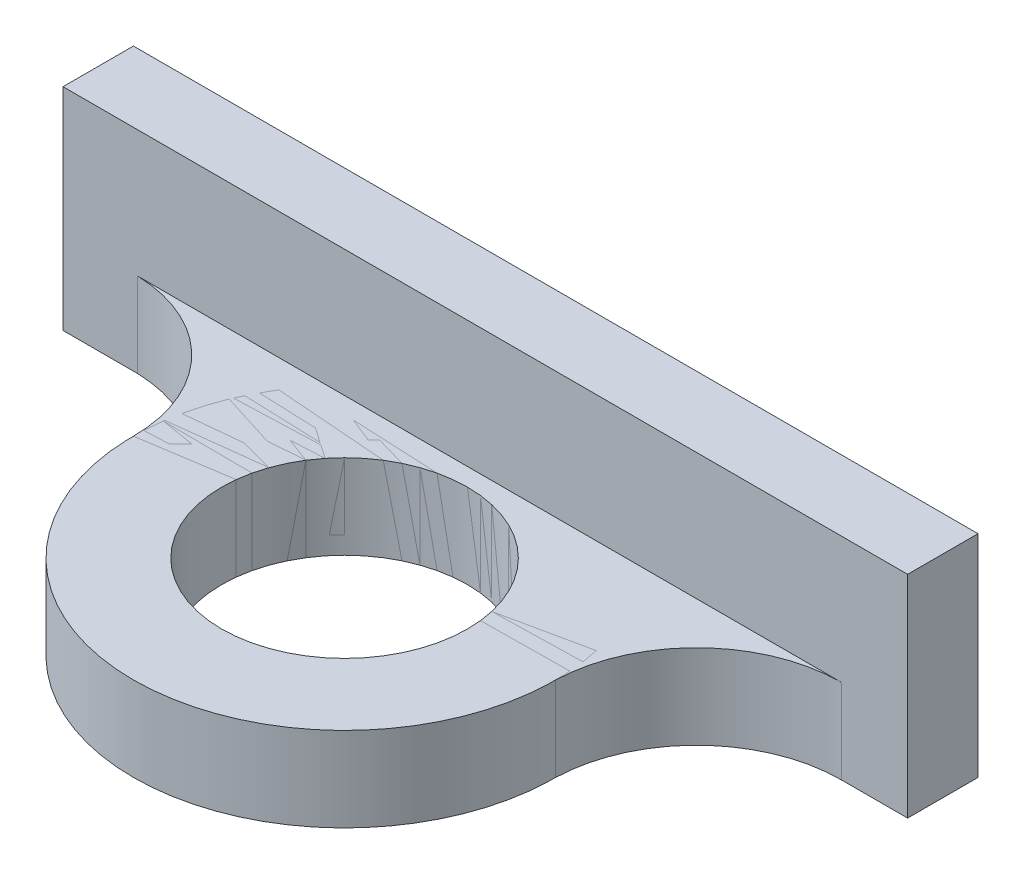
ISO-10303-21;
HEADER;
FILE_DESCRIPTION(('STEP AP214'),'2;1');
FILE_NAME('part.step','',(''),(''),'','','');
FILE_SCHEMA(('AUTOMOTIVE_DESIGN { 1 0 10303 214 1 1 1 1 }'));
ENDSEC;
DATA;
#1=APPLICATION_CONTEXT('core data for automotive mechanical design processes');
#2=APPLICATION_PROTOCOL_DEFINITION('international standard','automotive_design',2000,#1);
#3=PRODUCT_CONTEXT('',#1,'mechanical');
#4=PRODUCT('Part','Part','',(#3));
#5=PRODUCT_RELATED_PRODUCT_CATEGORY('part','',(#4));
#6=PRODUCT_DEFINITION_FORMATION('','',#4);
#7=PRODUCT_DEFINITION_CONTEXT('part definition',#1,'design');
#8=PRODUCT_DEFINITION('design','',#6,#7);
#9=PRODUCT_DEFINITION_SHAPE('','',#8);
#10=(LENGTH_UNIT() NAMED_UNIT(*) SI_UNIT(.MILLI.,.METRE.));
#11=(NAMED_UNIT(*) PLANE_ANGLE_UNIT() SI_UNIT($,.RADIAN.));
#12=(NAMED_UNIT(*) SI_UNIT($,.STERADIAN.) SOLID_ANGLE_UNIT());
#13=UNCERTAINTY_MEASURE_WITH_UNIT(LENGTH_MEASURE(1.E-05),#10,'distance_accuracy_value','');
#14=(GEOMETRIC_REPRESENTATION_CONTEXT(3) GLOBAL_UNCERTAINTY_ASSIGNED_CONTEXT((#13)) GLOBAL_UNIT_ASSIGNED_CONTEXT((#10,
#11,#12)) REPRESENTATION_CONTEXT('',''));
#15=CARTESIAN_POINT('',(0.,0.,0.));
#16=DIRECTION('',(0.,0.,1.));
#17=DIRECTION('',(1.,0.,0.));
#18=AXIS2_PLACEMENT_3D('',#15,#16,#17);
#19=CARTESIAN_POINT('',(0.,12.,-20.));
#20=DIRECTION('',(0.,0.,-1.));
#21=DIRECTION('',(-1.,0.,0.));
#22=AXIS2_PLACEMENT_3D('',#19,#20,#21);
#23=PLANE('',#22);
#24=DIRECTION('',(1.,0.,0.));
#25=VECTOR('',#24,1.);
#26=CARTESIAN_POINT('',(0.,0.,-20.));
#27=LINE('',#26,#25);
#28=CARTESIAN_POINT('',(-49.4267459225817,0.,-20.));
#29=VERTEX_POINT('',#28);
#30=CARTESIAN_POINT('',(50.5901699437495,0.,-20.));
#31=VERTEX_POINT('',#30);
#32=EDGE_CURVE('E131',#29,#31,#27,.T.);
#33=ORIENTED_EDGE('',*,*,#32,.F.);
#34=DIRECTION('',(0.,-1.,0.));
#35=VECTOR('',#34,1.);
#36=CARTESIAN_POINT('',(-49.4267459225817,12.,-20.));
#37=LINE('',#36,#35);
#38=CARTESIAN_POINT('',(-49.4267459225817,12.,-20.));
#39=VERTEX_POINT('',#38);
#40=EDGE_CURVE('E12',#39,#29,#37,.T.);
#41=ORIENTED_EDGE('',*,*,#40,.F.);
#42=DIRECTION('',(1.,0.,0.));
#43=VECTOR('',#42,1.);
#44=CARTESIAN_POINT('',(0.,12.,-20.));
#45=LINE('',#44,#43);
#46=CARTESIAN_POINT('',(50.5901699437495,12.,-20.));
#47=VERTEX_POINT('',#46);
#48=EDGE_CURVE('E145',#39,#47,#45,.T.);
#49=ORIENTED_EDGE('',*,*,#48,.T.);
#50=DIRECTION('',(0.,-1.,0.));
#51=VECTOR('',#50,1.);
#52=CARTESIAN_POINT('',(50.5901699437495,12.,-20.));
#53=LINE('',#52,#51);
#54=EDGE_CURVE('E49',#47,#31,#53,.T.);
#55=ORIENTED_EDGE('',*,*,#54,.T.);
#56=EDGE_LOOP('',(#33,#41,#49,#55));
#57=FACE_BOUND('',#56,.T.);
#58=ADVANCED_FACE('F46',(#57),#23,.T.);
#59=CARTESIAN_POINT('',(-50.0084579331656,12.,0.));
#60=DIRECTION('',(0.,-1.,0.));
#61=DIRECTION('',(0.,0.,-1.));
#62=AXIS2_PLACEMENT_3D('',#59,#60,#61);
#63=CYLINDRICAL_SURFACE('',#62,20.0084579331656);
#64=CARTESIAN_POINT('',(-50.0084579331656,0.,0.));
#65=DIRECTION('',(0.,-1.,0.));
#66=DIRECTION('',(0.,0.,-1.));
#67=AXIS2_PLACEMENT_3D('',#64,#65,#66);
#68=CIRCLE('',#67,20.0084579331656);
#69=CARTESIAN_POINT('',(-30.,0.,0.));
#70=VERTEX_POINT('',#69);
#71=EDGE_CURVE('E143',#70,#29,#68,.F.);
#72=ORIENTED_EDGE('',*,*,#71,.F.);
#73=DIRECTION('',(0.,-1.,0.));
#74=VECTOR('',#73,1.);
#75=CARTESIAN_POINT('',(-30.,12.,0.));
#76=LINE('',#75,#74);
#77=CARTESIAN_POINT('',(-30.,12.,0.));
#78=VERTEX_POINT('',#77);
#79=EDGE_CURVE('E55',#78,#70,#76,.T.);
#80=ORIENTED_EDGE('',*,*,#79,.F.);
#81=CARTESIAN_POINT('',(-50.0084579331656,12.,0.));
#82=DIRECTION('',(0.,-1.,0.));
#83=DIRECTION('',(0.,0.,-1.));
#84=AXIS2_PLACEMENT_3D('',#81,#82,#83);
#85=CIRCLE('',#84,20.0084579331656);
#86=EDGE_CURVE('E113',#78,#39,#85,.F.);
#87=ORIENTED_EDGE('',*,*,#86,.T.);
#88=ORIENTED_EDGE('',*,*,#40,.T.);
#89=EDGE_LOOP('',(#72,#80,#87,#88));
#90=FACE_BOUND('',#89,.T.);
#91=ADVANCED_FACE('F153',(#90),#63,.F.);
#92=CARTESIAN_POINT('',(0.,12.,0.));
#93=DIRECTION('',(0.,0.,-1.));
#94=DIRECTION('',(-1.,0.,0.));
#95=AXIS2_PLACEMENT_3D('',#92,#93,#94);
#96=PLANE('',#95);
#97=DIRECTION('',(1.,0.,0.));
#98=VECTOR('',#97,1.);
#99=CARTESIAN_POINT('',(0.,0.,0.));
#100=LINE('',#99,#98);
#101=CARTESIAN_POINT('',(-17.4625,0.,0.));
#102=VERTEX_POINT('',#101);
#103=EDGE_CURVE('E117',#70,#102,#100,.T.);
#104=ORIENTED_EDGE('',*,*,#103,.T.);
#105=DIRECTION('',(0.,-1.,0.));
#106=VECTOR('',#105,1.);
#107=CARTESIAN_POINT('',(-17.4625,12.,0.));
#108=LINE('',#107,#106);
#109=CARTESIAN_POINT('',(-17.4625,12.,0.));
#110=VERTEX_POINT('',#109);
#111=EDGE_CURVE('E115',#110,#102,#108,.T.);
#112=ORIENTED_EDGE('',*,*,#111,.F.);
#113=DIRECTION('',(1.,0.,0.));
#114=VECTOR('',#113,1.);
#115=CARTESIAN_POINT('',(0.,12.,0.));
#116=LINE('',#115,#114);
#117=EDGE_CURVE('E106',#78,#110,#116,.T.);
#118=ORIENTED_EDGE('',*,*,#117,.F.);
#119=ORIENTED_EDGE('',*,*,#79,.T.);
#120=EDGE_LOOP('',(#104,#112,#118,#119));
#121=FACE_BOUND('',#120,.T.);
#122=ADVANCED_FACE('F116',(#121),#96,.F.);
#123=CARTESIAN_POINT('',(0.,12.,0.));
#124=DIRECTION('',(0.,-1.,0.));
#125=DIRECTION('',(0.,0.,-1.));
#126=AXIS2_PLACEMENT_3D('',#123,#124,#125);
#127=CYLINDRICAL_SURFACE('',#126,17.4625);
#128=CARTESIAN_POINT('',(0.,0.,0.));
#129=DIRECTION('',(0.,-1.,0.));
#130=DIRECTION('',(0.,0.,-1.));
#131=AXIS2_PLACEMENT_3D('',#128,#129,#130);
#132=CIRCLE('',#131,17.4625);
#133=CARTESIAN_POINT('',(17.4625,0.,0.));
#134=VERTEX_POINT('',#133);
#135=EDGE_CURVE('E140',#134,#102,#132,.F.);
#136=ORIENTED_EDGE('',*,*,#135,.F.);
#137=DIRECTION('',(0.,-1.,0.));
#138=VECTOR('',#137,1.);
#139=CARTESIAN_POINT('',(17.4625,12.,0.));
#140=LINE('',#139,#138);
#141=CARTESIAN_POINT('',(17.4625,12.,0.));
#142=VERTEX_POINT('',#141);
#143=EDGE_CURVE('E121',#142,#134,#140,.T.);
#144=ORIENTED_EDGE('',*,*,#143,.F.);
#145=CARTESIAN_POINT('',(0.,12.,0.));
#146=DIRECTION('',(0.,-1.,0.));
#147=DIRECTION('',(0.,0.,-1.));
#148=AXIS2_PLACEMENT_3D('',#145,#146,#147);
#149=CIRCLE('',#148,17.4625);
#150=EDGE_CURVE('E111',#142,#110,#149,.F.);
#151=ORIENTED_EDGE('',*,*,#150,.T.);
#152=ORIENTED_EDGE('',*,*,#111,.T.);
#153=EDGE_LOOP('',(#136,#144,#151,#152));
#154=FACE_BOUND('',#153,.T.);
#155=ADVANCED_FACE('F123',(#154),#127,.F.);
#156=CARTESIAN_POINT('',(0.,12.,0.));
#157=DIRECTION('',(0.,0.,1.));
#158=DIRECTION('',(1.,0.,0.));
#159=AXIS2_PLACEMENT_3D('',#156,#157,#158);
#160=PLANE('',#159);
#161=DIRECTION('',(-1.,0.,0.));
#162=VECTOR('',#161,1.);
#163=CARTESIAN_POINT('',(0.,0.,0.));
#164=LINE('',#163,#162);
#165=CARTESIAN_POINT('',(30.,0.,0.));
#166=VERTEX_POINT('',#165);
#167=EDGE_CURVE('E137',#166,#134,#164,.T.);
#168=ORIENTED_EDGE('',*,*,#167,.F.);
#169=DIRECTION('',(0.,-1.,0.));
#170=VECTOR('',#169,1.);
#171=CARTESIAN_POINT('',(30.,12.,0.));
#172=LINE('',#171,#170);
#173=CARTESIAN_POINT('',(30.,12.,0.));
#174=VERTEX_POINT('',#173);
#175=EDGE_CURVE('E148',#174,#166,#172,.T.);
#176=ORIENTED_EDGE('',*,*,#175,.F.);
#177=DIRECTION('',(-1.,0.,0.));
#178=VECTOR('',#177,1.);
#179=CARTESIAN_POINT('',(0.,12.,0.));
#180=LINE('',#179,#178);
#181=EDGE_CURVE('E124',#174,#142,#180,.T.);
#182=ORIENTED_EDGE('',*,*,#181,.T.);
#183=ORIENTED_EDGE('',*,*,#143,.T.);
#184=EDGE_LOOP('',(#168,#176,#182,#183));
#185=FACE_BOUND('',#184,.T.);
#186=ADVANCED_FACE('F166',(#185),#160,.T.);
#187=CARTESIAN_POINT('',(50.5901699437495,12.,0.598877457812112));
#188=DIRECTION('',(0.,-1.,0.));
#189=DIRECTION('',(0.,0.,-1.));
#190=AXIS2_PLACEMENT_3D('',#187,#188,#189);
#191=CYLINDRICAL_SURFACE('',#190,20.5988774578121);
#192=CARTESIAN_POINT('',(50.5901699437495,0.,0.598877457812112));
#193=DIRECTION('',(0.,-1.,0.));
#194=DIRECTION('',(0.,0.,-1.));
#195=AXIS2_PLACEMENT_3D('',#192,#193,#194);
#196=CIRCLE('',#195,20.5988774578121);
#197=EDGE_CURVE('E134',#31,#166,#196,.F.);
#198=ORIENTED_EDGE('',*,*,#197,.F.);
#199=ORIENTED_EDGE('',*,*,#54,.F.);
#200=CARTESIAN_POINT('',(50.5901699437495,12.,0.598877457812112));
#201=DIRECTION('',(0.,-1.,0.));
#202=DIRECTION('',(0.,0.,-1.));
#203=AXIS2_PLACEMENT_3D('',#200,#201,#202);
#204=CIRCLE('',#203,20.5988774578121);
#205=EDGE_CURVE('E126',#47,#174,#204,.F.);
#206=ORIENTED_EDGE('',*,*,#205,.T.);
#207=ORIENTED_EDGE('',*,*,#175,.T.);
#208=EDGE_LOOP('',(#198,#199,#206,#207));
#209=FACE_BOUND('',#208,.T.);
#210=ADVANCED_FACE('F150',(#209),#191,.F.);
#211=CARTESIAN_POINT('',(0.,12.,0.));
#212=DIRECTION('',(0.,-1.,0.));
#213=DIRECTION('',(0.,0.,-1.));
#214=AXIS2_PLACEMENT_3D('',#211,#212,#213);
#215=PLANE('',#214);
#216=ORIENTED_EDGE('',*,*,#48,.F.);
#217=ORIENTED_EDGE('',*,*,#86,.F.);
#218=ORIENTED_EDGE('',*,*,#117,.T.);
#219=ORIENTED_EDGE('',*,*,#150,.F.);
#220=ORIENTED_EDGE('',*,*,#181,.F.);
#221=ORIENTED_EDGE('',*,*,#205,.F.);
#222=EDGE_LOOP('',(#216,#217,#218,#219,#220,#221));
#223=FACE_BOUND('',#222,.T.);
#224=ADVANCED_FACE('F108',(#223),#215,.F.);
#225=CARTESIAN_POINT('',(0.,0.,0.));
#226=DIRECTION('',(0.,-1.,0.));
#227=DIRECTION('',(0.,0.,-1.));
#228=AXIS2_PLACEMENT_3D('',#225,#226,#227);
#229=PLANE('',#228);
#230=ORIENTED_EDGE('',*,*,#32,.T.);
#231=ORIENTED_EDGE('',*,*,#197,.T.);
#232=ORIENTED_EDGE('',*,*,#167,.T.);
#233=ORIENTED_EDGE('',*,*,#135,.T.);
#234=ORIENTED_EDGE('',*,*,#103,.F.);
#235=ORIENTED_EDGE('',*,*,#71,.T.);
#236=EDGE_LOOP('',(#230,#231,#232,#233,#234,#235));
#237=FACE_BOUND('',#236,.T.);
#238=ADVANCED_FACE('F152',(#237),#229,.T.);
#239=CLOSED_SHELL('',(#58,#91,#122,#155,#186,#210,#224,#238));
#240=MANIFOLD_SOLID_BREP('B2',#239);
#241=CARTESIAN_POINT('',(0.,12.,0.));
#242=DIRECTION('',(0.,1.,0.));
#243=DIRECTION('',(0.,0.,1.));
#244=AXIS2_PLACEMENT_3D('',#241,#242,#243);
#245=PLANE('',#244);
#246=DIRECTION('',(1.,0.,0.));
#247=VECTOR('',#246,1.);
#248=CARTESIAN_POINT('',(0.,12.,-20.));
#249=LINE('',#248,#247);
#250=CARTESIAN_POINT('',(-22.3606797749979,12.,-20.));
#251=VERTEX_POINT('',#250);
#252=CARTESIAN_POINT('',(22.3606797749979,12.,-20.));
#253=VERTEX_POINT('',#252);
#254=EDGE_CURVE('E263',#251,#253,#249,.T.);
#255=ORIENTED_EDGE('',*,*,#254,.F.);
#256=CARTESIAN_POINT('',(0.,12.,0.));
#257=DIRECTION('',(0.,1.,0.));
#258=DIRECTION('',(0.,0.,1.));
#259=AXIS2_PLACEMENT_3D('',#256,#257,#258);
#260=CIRCLE('',#259,30.);
#261=EDGE_CURVE('E346',#251,#253,#260,.T.);
#262=ORIENTED_EDGE('',*,*,#261,.T.);
#263=EDGE_LOOP('',(#255,#262));
#264=FACE_BOUND('',#263,.T.);
#265=CARTESIAN_POINT('',(0.,12.,0.));
#266=DIRECTION('',(0.,1.,0.));
#267=DIRECTION('',(0.,0.,1.));
#268=AXIS2_PLACEMENT_3D('',#265,#266,#267);
#269=CIRCLE('',#268,17.4625);
#270=CARTESIAN_POINT('',(0.,12.,17.4625));
#271=VERTEX_POINT('',#270);
#272=EDGE_CURVE('E341',#271,#271,#269,.T.);
#273=ORIENTED_EDGE('',*,*,#272,.F.);
#274=EDGE_LOOP('',(#273));
#275=FACE_BOUND('',#274,.T.);
#276=ADVANCED_FACE('F242',(#264,#275),#245,.T.);
#277=CARTESIAN_POINT('',(0.,0.,0.));
#278=DIRECTION('',(0.,1.,0.));
#279=DIRECTION('',(0.,0.,1.));
#280=AXIS2_PLACEMENT_3D('',#277,#278,#279);
#281=PLANE('',#280);
#282=CARTESIAN_POINT('',(0.,0.,0.));
#283=DIRECTION('',(0.,1.,0.));
#284=DIRECTION('',(0.,0.,1.));
#285=AXIS2_PLACEMENT_3D('',#282,#283,#284);
#286=CIRCLE('',#285,30.);
#287=CARTESIAN_POINT('',(-22.3606797749979,0.,-20.));
#288=VERTEX_POINT('',#287);
#289=CARTESIAN_POINT('',(22.3606797749979,0.,-20.));
#290=VERTEX_POINT('',#289);
#291=EDGE_CURVE('E256',#288,#290,#286,.T.);
#292=ORIENTED_EDGE('',*,*,#291,.F.);
#293=DIRECTION('',(-1.,0.,0.));
#294=VECTOR('',#293,1.);
#295=CARTESIAN_POINT('',(0.,0.,-20.));
#296=LINE('',#295,#294);
#297=CARTESIAN_POINT('',(-60.,0.,-20.));
#298=VERTEX_POINT('',#297);
#299=EDGE_CURVE('E328',#288,#298,#296,.T.);
#300=ORIENTED_EDGE('',*,*,#299,.T.);
#301=DIRECTION('',(0.,0.,-1.));
#302=VECTOR('',#301,1.);
#303=CARTESIAN_POINT('',(-60.,0.,-30.));
#304=LINE('',#303,#302);
#305=CARTESIAN_POINT('',(-60.,0.,-30.));
#306=VERTEX_POINT('',#305);
#307=EDGE_CURVE('E307',#298,#306,#304,.T.);
#308=ORIENTED_EDGE('',*,*,#307,.T.);
#309=DIRECTION('',(1.,0.,0.));
#310=VECTOR('',#309,1.);
#311=CARTESIAN_POINT('',(0.,0.,-30.));
#312=LINE('',#311,#310);
#313=CARTESIAN_POINT('',(60.,0.,-30.));
#314=VERTEX_POINT('',#313);
#315=EDGE_CURVE('E325',#306,#314,#312,.T.);
#316=ORIENTED_EDGE('',*,*,#315,.T.);
#317=DIRECTION('',(0.,0.,1.));
#318=VECTOR('',#317,1.);
#319=CARTESIAN_POINT('',(60.,0.,-30.));
#320=LINE('',#319,#318);
#321=CARTESIAN_POINT('',(60.,0.,-20.));
#322=VERTEX_POINT('',#321);
#323=EDGE_CURVE('E314',#314,#322,#320,.T.);
#324=ORIENTED_EDGE('',*,*,#323,.T.);
#325=EDGE_CURVE('E329',#322,#290,#296,.T.);
#326=ORIENTED_EDGE('',*,*,#325,.T.);
#327=EDGE_LOOP('',(#292,#300,#308,#316,#324,#326));
#328=FACE_BOUND('',#327,.T.);
#329=CARTESIAN_POINT('',(0.,0.,0.));
#330=DIRECTION('',(0.,1.,0.));
#331=DIRECTION('',(0.,0.,1.));
#332=AXIS2_PLACEMENT_3D('',#329,#330,#331);
#333=CIRCLE('',#332,17.4625);
#334=CARTESIAN_POINT('',(0.,0.,17.4625));
#335=VERTEX_POINT('',#334);
#336=EDGE_CURVE('E340',#335,#335,#333,.T.);
#337=ORIENTED_EDGE('',*,*,#336,.T.);
#338=EDGE_LOOP('',(#337));
#339=FACE_BOUND('',#338,.T.);
#340=ADVANCED_FACE('F356',(#328,#339),#281,.F.);
#341=CARTESIAN_POINT('',(0.,12.,0.));
#342=DIRECTION('',(0.,-1.,0.));
#343=DIRECTION('',(0.,0.,-1.));
#344=AXIS2_PLACEMENT_3D('',#341,#342,#343);
#345=CYLINDRICAL_SURFACE('',#344,30.);
#346=ORIENTED_EDGE('',*,*,#261,.F.);
#347=DIRECTION('',(0.,-1.,0.));
#348=VECTOR('',#347,1.);
#349=CARTESIAN_POINT('',(-22.3606797749979,12.,-20.));
#350=LINE('',#349,#348);
#351=EDGE_CURVE('E44',#251,#288,#350,.T.);
#352=ORIENTED_EDGE('',*,*,#351,.T.);
#353=ORIENTED_EDGE('',*,*,#291,.T.);
#354=DIRECTION('',(0.,-1.,0.));
#355=VECTOR('',#354,1.);
#356=CARTESIAN_POINT('',(22.3606797749979,12.,-20.));
#357=LINE('',#356,#355);
#358=EDGE_CURVE('E250',#290,#253,#357,.F.);
#359=ORIENTED_EDGE('',*,*,#358,.T.);
#360=EDGE_LOOP('',(#346,#352,#353,#359));
#361=FACE_BOUND('',#360,.T.);
#362=ADVANCED_FACE('F244',(#361),#345,.T.);
#363=CARTESIAN_POINT('',(0.,12.,0.));
#364=DIRECTION('',(0.,-1.,0.));
#365=DIRECTION('',(0.,0.,-1.));
#366=AXIS2_PLACEMENT_3D('',#363,#364,#365);
#367=CYLINDRICAL_SURFACE('',#366,17.4625);
#368=ORIENTED_EDGE('',*,*,#272,.T.);
#369=EDGE_LOOP('',(#368));
#370=FACE_BOUND('',#369,.T.);
#371=ORIENTED_EDGE('',*,*,#336,.F.);
#372=EDGE_LOOP('',(#371));
#373=FACE_BOUND('',#372,.T.);
#374=ADVANCED_FACE('F367',(#370,#373),#367,.F.);
#375=CARTESIAN_POINT('',(0.,30.,-20.));
#376=DIRECTION('',(0.,0.,1.));
#377=DIRECTION('',(1.,0.,0.));
#378=AXIS2_PLACEMENT_3D('',#375,#376,#377);
#379=PLANE('',#378);
#380=ORIENTED_EDGE('',*,*,#351,.F.);
#381=ORIENTED_EDGE('',*,*,#254,.T.);
#382=ORIENTED_EDGE('',*,*,#358,.F.);
#383=ORIENTED_EDGE('',*,*,#325,.F.);
#384=DIRECTION('',(0.,-1.,0.));
#385=VECTOR('',#384,1.);
#386=CARTESIAN_POINT('',(60.,30.,-20.));
#387=LINE('',#386,#385);
#388=CARTESIAN_POINT('',(60.,30.,-20.));
#389=VERTEX_POINT('',#388);
#390=EDGE_CURVE('E315',#389,#322,#387,.T.);
#391=ORIENTED_EDGE('',*,*,#390,.F.);
#392=DIRECTION('',(-1.,0.,0.));
#393=VECTOR('',#392,1.);
#394=CARTESIAN_POINT('',(60.,30.,-20.));
#395=LINE('',#394,#393);
#396=CARTESIAN_POINT('',(-60.,30.,-20.));
#397=VERTEX_POINT('',#396);
#398=EDGE_CURVE('E320',#389,#397,#395,.T.);
#399=ORIENTED_EDGE('',*,*,#398,.T.);
#400=DIRECTION('',(0.,-1.,0.));
#401=VECTOR('',#400,1.);
#402=CARTESIAN_POINT('',(-60.,30.,-20.));
#403=LINE('',#402,#401);
#404=EDGE_CURVE('E335',#397,#298,#403,.T.);
#405=ORIENTED_EDGE('',*,*,#404,.T.);
#406=ORIENTED_EDGE('',*,*,#299,.F.);
#407=EDGE_LOOP('',(#380,#381,#382,#383,#391,#399,#405,#406));
#408=FACE_BOUND('',#407,.T.);
#409=ADVANCED_FACE('F351',(#408),#379,.T.);
#410=CARTESIAN_POINT('',(-60.,30.,-30.));
#411=DIRECTION('',(-1.,0.,0.));
#412=DIRECTION('',(0.,0.,1.));
#413=AXIS2_PLACEMENT_3D('',#410,#411,#412);
#414=PLANE('',#413);
#415=ORIENTED_EDGE('',*,*,#307,.F.);
#416=ORIENTED_EDGE('',*,*,#404,.F.);
#417=DIRECTION('',(0.,0.,-1.));
#418=VECTOR('',#417,1.);
#419=CARTESIAN_POINT('',(-60.,30.,-30.));
#420=LINE('',#419,#418);
#421=CARTESIAN_POINT('',(-60.,30.,-30.));
#422=VERTEX_POINT('',#421);
#423=EDGE_CURVE('E316',#397,#422,#420,.T.);
#424=ORIENTED_EDGE('',*,*,#423,.T.);
#425=DIRECTION('',(0.,-1.,0.));
#426=VECTOR('',#425,1.);
#427=CARTESIAN_POINT('',(-60.,30.,-30.));
#428=LINE('',#427,#426);
#429=EDGE_CURVE('E301',#422,#306,#428,.T.);
#430=ORIENTED_EDGE('',*,*,#429,.T.);
#431=EDGE_LOOP('',(#415,#416,#424,#430));
#432=FACE_BOUND('',#431,.T.);
#433=ADVANCED_FACE('F359',(#432),#414,.T.);
#434=CARTESIAN_POINT('',(60.,30.,-30.));
#435=DIRECTION('',(1.,0.,0.));
#436=DIRECTION('',(0.,0.,-1.));
#437=AXIS2_PLACEMENT_3D('',#434,#435,#436);
#438=PLANE('',#437);
#439=ORIENTED_EDGE('',*,*,#323,.F.);
#440=DIRECTION('',(0.,-1.,0.));
#441=VECTOR('',#440,1.);
#442=CARTESIAN_POINT('',(60.,30.,-30.));
#443=LINE('',#442,#441);
#444=CARTESIAN_POINT('',(60.,30.,-30.));
#445=VERTEX_POINT('',#444);
#446=EDGE_CURVE('E298',#445,#314,#443,.T.);
#447=ORIENTED_EDGE('',*,*,#446,.F.);
#448=DIRECTION('',(0.,0.,1.));
#449=VECTOR('',#448,1.);
#450=CARTESIAN_POINT('',(60.,30.,-30.));
#451=LINE('',#450,#449);
#452=EDGE_CURVE('E306',#445,#389,#451,.T.);
#453=ORIENTED_EDGE('',*,*,#452,.T.);
#454=ORIENTED_EDGE('',*,*,#390,.T.);
#455=EDGE_LOOP('',(#439,#447,#453,#454));
#456=FACE_BOUND('',#455,.T.);
#457=ADVANCED_FACE('F311',(#456),#438,.T.);
#458=CARTESIAN_POINT('',(0.,30.,-30.));
#459=DIRECTION('',(0.,0.,-1.));
#460=DIRECTION('',(-1.,0.,0.));
#461=AXIS2_PLACEMENT_3D('',#458,#459,#460);
#462=PLANE('',#461);
#463=ORIENTED_EDGE('',*,*,#315,.F.);
#464=ORIENTED_EDGE('',*,*,#429,.F.);
#465=DIRECTION('',(1.,0.,0.));
#466=VECTOR('',#465,1.);
#467=CARTESIAN_POINT('',(0.,30.,-30.));
#468=LINE('',#467,#466);
#469=EDGE_CURVE('E295',#422,#445,#468,.T.);
#470=ORIENTED_EDGE('',*,*,#469,.T.);
#471=ORIENTED_EDGE('',*,*,#446,.T.);
#472=EDGE_LOOP('',(#463,#464,#470,#471));
#473=FACE_BOUND('',#472,.T.);
#474=ADVANCED_FACE('F297',(#473),#462,.T.);
#475=CARTESIAN_POINT('',(0.,30.,0.));
#476=DIRECTION('',(0.,1.,0.));
#477=DIRECTION('',(0.,0.,1.));
#478=AXIS2_PLACEMENT_3D('',#475,#476,#477);
#479=PLANE('',#478);
#480=ORIENTED_EDGE('',*,*,#469,.F.);
#481=ORIENTED_EDGE('',*,*,#423,.F.);
#482=ORIENTED_EDGE('',*,*,#398,.F.);
#483=ORIENTED_EDGE('',*,*,#452,.F.);
#484=EDGE_LOOP('',(#480,#481,#482,#483));
#485=FACE_BOUND('',#484,.T.);
#486=ADVANCED_FACE('F319',(#485),#479,.T.);
#487=CLOSED_SHELL('',(#276,#340,#362,#374,#409,#433,#457,#474,#486));
#488=MANIFOLD_SOLID_BREP('B6',#487);
#489=ADVANCED_BREP_SHAPE_REPRESENTATION('',(#18,#240,#488),#14);
#490=SHAPE_DEFINITION_REPRESENTATION(#9,#489);
ENDSEC;
END-ISO-10303-21;
